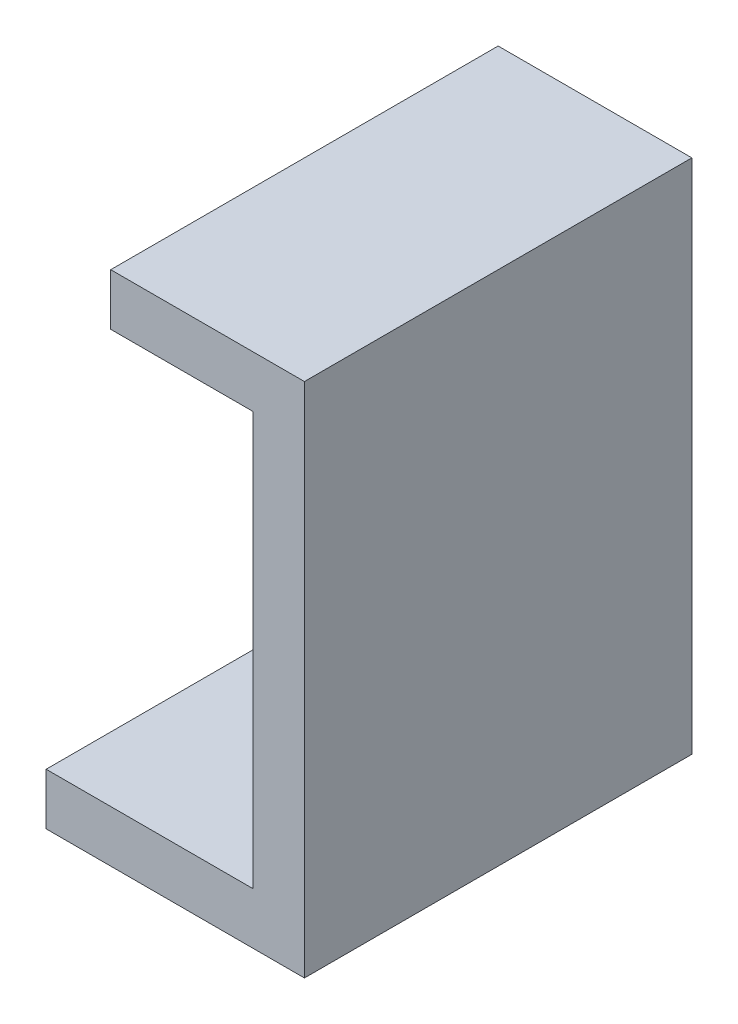
ISO-10303-21;
HEADER;
FILE_DESCRIPTION(('STEP AP214'),'2;1');
FILE_NAME('part.step','',(''),(''),'','','');
FILE_SCHEMA(('AUTOMOTIVE_DESIGN { 1 0 10303 214 1 1 1 1 }'));
ENDSEC;
DATA;
#1=APPLICATION_CONTEXT('core data for automotive mechanical design processes');
#2=APPLICATION_PROTOCOL_DEFINITION('international standard','automotive_design',2000,#1);
#3=PRODUCT_CONTEXT('',#1,'mechanical');
#4=PRODUCT('Part','Part','',(#3));
#5=PRODUCT_RELATED_PRODUCT_CATEGORY('part','',(#4));
#6=PRODUCT_DEFINITION_FORMATION('','',#4);
#7=PRODUCT_DEFINITION_CONTEXT('part definition',#1,'design');
#8=PRODUCT_DEFINITION('design','',#6,#7);
#9=PRODUCT_DEFINITION_SHAPE('','',#8);
#10=(LENGTH_UNIT() NAMED_UNIT(*) SI_UNIT(.MILLI.,.METRE.));
#11=(NAMED_UNIT(*) PLANE_ANGLE_UNIT() SI_UNIT($,.RADIAN.));
#12=(NAMED_UNIT(*) SI_UNIT($,.STERADIAN.) SOLID_ANGLE_UNIT());
#13=UNCERTAINTY_MEASURE_WITH_UNIT(LENGTH_MEASURE(1.E-05),#10,'distance_accuracy_value','');
#14=(GEOMETRIC_REPRESENTATION_CONTEXT(3) GLOBAL_UNCERTAINTY_ASSIGNED_CONTEXT((#13)) GLOBAL_UNIT_ASSIGNED_CONTEXT((#10,
#11,#12)) REPRESENTATION_CONTEXT('',''));
#15=CARTESIAN_POINT('',(0.,0.,0.));
#16=DIRECTION('',(0.,0.,1.));
#17=DIRECTION('',(1.,0.,0.));
#18=AXIS2_PLACEMENT_3D('',#15,#16,#17);
#19=CARTESIAN_POINT('',(-2.18399212189662,34.8873086385771,38.1));
#20=DIRECTION('',(0.,-1.,0.));
#21=DIRECTION('',(1.,0.,0.));
#22=AXIS2_PLACEMENT_3D('',#19,#20,#21);
#23=PLANE('',#22);
#24=DIRECTION('',(-1.,0.,0.));
#25=VECTOR('',#24,1.);
#26=CARTESIAN_POINT('',(-2.18399212189662,34.8873086385771,0.));
#27=LINE('',#26,#25);
#28=CARTESIAN_POINT('',(-2.18399212189662,34.8873086385771,0.));
#29=VERTEX_POINT('',#28);
#30=CARTESIAN_POINT('',(-21.2339921218966,34.887308638577,0.));
#31=VERTEX_POINT('',#30);
#32=EDGE_CURVE('E140',#29,#31,#27,.T.);
#33=ORIENTED_EDGE('',*,*,#32,.T.);
#34=DIRECTION('',(0.,0.,-1.));
#35=VECTOR('',#34,1.);
#36=CARTESIAN_POINT('',(-21.2339921218966,34.887308638577,38.1));
#37=LINE('',#36,#35);
#38=CARTESIAN_POINT('',(-21.2339921218966,34.887308638577,38.1));
#39=VERTEX_POINT('',#38);
#40=EDGE_CURVE('E11',#39,#31,#37,.T.);
#41=ORIENTED_EDGE('',*,*,#40,.F.);
#42=DIRECTION('',(-1.,0.,0.));
#43=VECTOR('',#42,1.);
#44=CARTESIAN_POINT('',(-2.18399212189662,34.8873086385771,38.1));
#45=LINE('',#44,#43);
#46=CARTESIAN_POINT('',(-2.18399212189662,34.8873086385771,38.1));
#47=VERTEX_POINT('',#46);
#48=EDGE_CURVE('E162',#47,#39,#45,.T.);
#49=ORIENTED_EDGE('',*,*,#48,.F.);
#50=DIRECTION('',(0.,0.,-1.));
#51=VECTOR('',#50,1.);
#52=CARTESIAN_POINT('',(-2.18399212189662,34.8873086385771,38.1));
#53=LINE('',#52,#51);
#54=EDGE_CURVE('E136',#47,#29,#53,.T.);
#55=ORIENTED_EDGE('',*,*,#54,.T.);
#56=EDGE_LOOP('',(#33,#41,#49,#55));
#57=FACE_BOUND('',#56,.T.);
#58=ADVANCED_FACE('F39',(#57),#23,.F.);
#59=CARTESIAN_POINT('',(-21.2339921218966,34.887308638577,38.1));
#60=DIRECTION('',(1.,0.,0.));
#61=DIRECTION('',(0.,0.,-1.));
#62=AXIS2_PLACEMENT_3D('',#59,#60,#61);
#63=PLANE('',#62);
#64=DIRECTION('',(0.,-1.,0.));
#65=VECTOR('',#64,1.);
#66=CARTESIAN_POINT('',(-21.2339921218966,34.887308638577,0.));
#67=LINE('',#66,#65);
#68=CARTESIAN_POINT('',(-21.2339921218966,29.8073086385771,0.));
#69=VERTEX_POINT('',#68);
#70=EDGE_CURVE('E144',#31,#69,#67,.T.);
#71=ORIENTED_EDGE('',*,*,#70,.T.);
#72=DIRECTION('',(0.,0.,-1.));
#73=VECTOR('',#72,1.);
#74=CARTESIAN_POINT('',(-21.2339921218966,29.8073086385771,38.1));
#75=LINE('',#74,#73);
#76=CARTESIAN_POINT('',(-21.2339921218966,29.8073086385771,38.1));
#77=VERTEX_POINT('',#76);
#78=EDGE_CURVE('E48',#77,#69,#75,.T.);
#79=ORIENTED_EDGE('',*,*,#78,.F.);
#80=DIRECTION('',(0.,-1.,0.));
#81=VECTOR('',#80,1.);
#82=CARTESIAN_POINT('',(-21.2339921218966,34.887308638577,38.1));
#83=LINE('',#82,#81);
#84=EDGE_CURVE('E99',#39,#77,#83,.T.);
#85=ORIENTED_EDGE('',*,*,#84,.F.);
#86=ORIENTED_EDGE('',*,*,#40,.T.);
#87=EDGE_LOOP('',(#71,#79,#85,#86));
#88=FACE_BOUND('',#87,.T.);
#89=ADVANCED_FACE('F208',(#88),#63,.F.);
#90=CARTESIAN_POINT('',(-21.2339921218966,29.8073086385771,38.1));
#91=DIRECTION('',(0.,1.,0.));
#92=DIRECTION('',(0.,0.,1.));
#93=AXIS2_PLACEMENT_3D('',#90,#91,#92);
#94=PLANE('',#93);
#95=DIRECTION('',(1.,0.,0.));
#96=VECTOR('',#95,1.);
#97=CARTESIAN_POINT('',(-21.2339921218966,29.8073086385771,0.));
#98=LINE('',#97,#96);
#99=CARTESIAN_POINT('',(-7.26399212189662,29.8073086385771,0.));
#100=VERTEX_POINT('',#99);
#101=EDGE_CURVE('E147',#69,#100,#98,.T.);
#102=ORIENTED_EDGE('',*,*,#101,.T.);
#103=DIRECTION('',(0.,0.,-1.));
#104=VECTOR('',#103,1.);
#105=CARTESIAN_POINT('',(-7.26399212189662,29.8073086385771,38.1));
#106=LINE('',#105,#104);
#107=CARTESIAN_POINT('',(-7.26399212189662,29.8073086385771,38.1));
#108=VERTEX_POINT('',#107);
#109=EDGE_CURVE('E173',#108,#100,#106,.T.);
#110=ORIENTED_EDGE('',*,*,#109,.F.);
#111=DIRECTION('',(1.,0.,0.));
#112=VECTOR('',#111,1.);
#113=CARTESIAN_POINT('',(-21.2339921218966,29.8073086385771,38.1));
#114=LINE('',#113,#112);
#115=EDGE_CURVE('E183',#77,#108,#114,.T.);
#116=ORIENTED_EDGE('',*,*,#115,.F.);
#117=ORIENTED_EDGE('',*,*,#78,.T.);
#118=EDGE_LOOP('',(#102,#110,#116,#117));
#119=FACE_BOUND('',#118,.T.);
#120=ADVANCED_FACE('F181',(#119),#94,.F.);
#121=CARTESIAN_POINT('',(-7.26399212189662,29.8073086385771,38.1));
#122=DIRECTION('',(1.,0.,0.));
#123=DIRECTION('',(0.,1.,0.));
#124=AXIS2_PLACEMENT_3D('',#121,#122,#123);
#125=PLANE('',#124);
#126=DIRECTION('',(0.,-1.,0.));
#127=VECTOR('',#126,1.);
#128=CARTESIAN_POINT('',(-7.26399212189662,29.8073086385771,0.));
#129=LINE('',#128,#127);
#130=CARTESIAN_POINT('',(-7.26399212189662,-10.8326913614229,0.));
#131=VERTEX_POINT('',#130);
#132=EDGE_CURVE('E150',#100,#131,#129,.T.);
#133=ORIENTED_EDGE('',*,*,#132,.T.);
#134=DIRECTION('',(0.,0.,-1.));
#135=VECTOR('',#134,1.);
#136=CARTESIAN_POINT('',(-7.26399212189662,-10.8326913614229,38.1));
#137=LINE('',#136,#135);
#138=CARTESIAN_POINT('',(-7.26399212189662,-10.8326913614229,38.1));
#139=VERTEX_POINT('',#138);
#140=EDGE_CURVE('E169',#139,#131,#137,.T.);
#141=ORIENTED_EDGE('',*,*,#140,.F.);
#142=DIRECTION('',(0.,-1.,0.));
#143=VECTOR('',#142,1.);
#144=CARTESIAN_POINT('',(-7.26399212189662,29.8073086385771,38.1));
#145=LINE('',#144,#143);
#146=EDGE_CURVE('E196',#108,#139,#145,.T.);
#147=ORIENTED_EDGE('',*,*,#146,.F.);
#148=ORIENTED_EDGE('',*,*,#109,.T.);
#149=EDGE_LOOP('',(#133,#141,#147,#148));
#150=FACE_BOUND('',#149,.T.);
#151=ADVANCED_FACE('F191',(#150),#125,.F.);
#152=CARTESIAN_POINT('',(-7.26399212189662,-10.8326913614229,38.1));
#153=DIRECTION('',(0.,-1.,0.));
#154=DIRECTION('',(1.,0.,0.));
#155=AXIS2_PLACEMENT_3D('',#152,#153,#154);
#156=PLANE('',#155);
#157=DIRECTION('',(-1.,0.,0.));
#158=VECTOR('',#157,1.);
#159=CARTESIAN_POINT('',(-7.26399212189662,-10.8326913614229,0.));
#160=LINE('',#159,#158);
#161=CARTESIAN_POINT('',(-27.5839921218966,-10.8326913614229,0.));
#162=VERTEX_POINT('',#161);
#163=EDGE_CURVE('E153',#131,#162,#160,.T.);
#164=ORIENTED_EDGE('',*,*,#163,.T.);
#165=DIRECTION('',(0.,0.,-1.));
#166=VECTOR('',#165,1.);
#167=CARTESIAN_POINT('',(-27.5839921218966,-10.8326913614229,38.1));
#168=LINE('',#167,#166);
#169=CARTESIAN_POINT('',(-27.5839921218966,-10.8326913614229,38.1));
#170=VERTEX_POINT('',#169);
#171=EDGE_CURVE('E129',#170,#162,#168,.T.);
#172=ORIENTED_EDGE('',*,*,#171,.F.);
#173=DIRECTION('',(-1.,0.,0.));
#174=VECTOR('',#173,1.);
#175=CARTESIAN_POINT('',(-7.26399212189662,-10.8326913614229,38.1));
#176=LINE('',#175,#174);
#177=EDGE_CURVE('E118',#139,#170,#176,.T.);
#178=ORIENTED_EDGE('',*,*,#177,.F.);
#179=ORIENTED_EDGE('',*,*,#140,.T.);
#180=EDGE_LOOP('',(#164,#172,#178,#179));
#181=FACE_BOUND('',#180,.T.);
#182=ADVANCED_FACE('F194',(#181),#156,.F.);
#183=CARTESIAN_POINT('',(-27.5839921218966,-10.8326913614229,38.1));
#184=DIRECTION('',(1.,0.,0.));
#185=DIRECTION('',(0.,1.,0.));
#186=AXIS2_PLACEMENT_3D('',#183,#184,#185);
#187=PLANE('',#186);
#188=DIRECTION('',(0.,-1.,0.));
#189=VECTOR('',#188,1.);
#190=CARTESIAN_POINT('',(-27.5839921218966,-10.8326913614229,0.));
#191=LINE('',#190,#189);
#192=CARTESIAN_POINT('',(-27.5839921218966,-15.9126913614229,0.));
#193=VERTEX_POINT('',#192);
#194=EDGE_CURVE('E127',#162,#193,#191,.T.);
#195=ORIENTED_EDGE('',*,*,#194,.T.);
#196=DIRECTION('',(0.,0.,-1.));
#197=VECTOR('',#196,1.);
#198=CARTESIAN_POINT('',(-27.5839921218966,-15.9126913614229,38.1));
#199=LINE('',#198,#197);
#200=CARTESIAN_POINT('',(-27.5839921218966,-15.9126913614229,38.1));
#201=VERTEX_POINT('',#200);
#202=EDGE_CURVE('E124',#201,#193,#199,.T.);
#203=ORIENTED_EDGE('',*,*,#202,.F.);
#204=DIRECTION('',(0.,-1.,0.));
#205=VECTOR('',#204,1.);
#206=CARTESIAN_POINT('',(-27.5839921218966,-10.8326913614229,38.1));
#207=LINE('',#206,#205);
#208=EDGE_CURVE('E112',#170,#201,#207,.T.);
#209=ORIENTED_EDGE('',*,*,#208,.F.);
#210=ORIENTED_EDGE('',*,*,#171,.T.);
#211=EDGE_LOOP('',(#195,#203,#209,#210));
#212=FACE_BOUND('',#211,.T.);
#213=ADVANCED_FACE('F125',(#212),#187,.F.);
#214=CARTESIAN_POINT('',(-27.5839921218966,-15.9126913614229,38.1));
#215=DIRECTION('',(0.,1.,0.));
#216=DIRECTION('',(0.,0.,1.));
#217=AXIS2_PLACEMENT_3D('',#214,#215,#216);
#218=PLANE('',#217);
#219=DIRECTION('',(1.,0.,0.));
#220=VECTOR('',#219,1.);
#221=CARTESIAN_POINT('',(-27.5839921218966,-15.9126913614229,0.));
#222=LINE('',#221,#220);
#223=CARTESIAN_POINT('',(-2.18399212189662,-15.9126913614229,0.));
#224=VERTEX_POINT('',#223);
#225=EDGE_CURVE('E85',#193,#224,#222,.T.);
#226=ORIENTED_EDGE('',*,*,#225,.T.);
#227=DIRECTION('',(0.,0.,-1.));
#228=VECTOR('',#227,1.);
#229=CARTESIAN_POINT('',(-2.18399212189662,-15.9126913614229,38.1));
#230=LINE('',#229,#228);
#231=CARTESIAN_POINT('',(-2.18399212189662,-15.9126913614229,38.1));
#232=VERTEX_POINT('',#231);
#233=EDGE_CURVE('E130',#232,#224,#230,.T.);
#234=ORIENTED_EDGE('',*,*,#233,.F.);
#235=DIRECTION('',(1.,0.,0.));
#236=VECTOR('',#235,1.);
#237=CARTESIAN_POINT('',(-27.5839921218966,-15.9126913614229,38.1));
#238=LINE('',#237,#236);
#239=EDGE_CURVE('E116',#201,#232,#238,.T.);
#240=ORIENTED_EDGE('',*,*,#239,.F.);
#241=ORIENTED_EDGE('',*,*,#202,.T.);
#242=EDGE_LOOP('',(#226,#234,#240,#241));
#243=FACE_BOUND('',#242,.T.);
#244=ADVANCED_FACE('F132',(#243),#218,.F.);
#245=CARTESIAN_POINT('',(-2.18399212189662,-15.9126913614229,38.1));
#246=DIRECTION('',(-1.,0.,0.));
#247=DIRECTION('',(0.,0.,1.));
#248=AXIS2_PLACEMENT_3D('',#245,#246,#247);
#249=PLANE('',#248);
#250=DIRECTION('',(0.,1.,0.));
#251=VECTOR('',#250,1.);
#252=CARTESIAN_POINT('',(-2.18399212189662,-15.9126913614229,0.));
#253=LINE('',#252,#251);
#254=EDGE_CURVE('E91',#224,#29,#253,.T.);
#255=ORIENTED_EDGE('',*,*,#254,.T.);
#256=ORIENTED_EDGE('',*,*,#54,.F.);
#257=DIRECTION('',(0.,1.,0.));
#258=VECTOR('',#257,1.);
#259=CARTESIAN_POINT('',(-2.18399212189662,-15.9126913614229,38.1));
#260=LINE('',#259,#258);
#261=EDGE_CURVE('E56',#232,#47,#260,.T.);
#262=ORIENTED_EDGE('',*,*,#261,.F.);
#263=ORIENTED_EDGE('',*,*,#233,.T.);
#264=EDGE_LOOP('',(#255,#256,#262,#263));
#265=FACE_BOUND('',#264,.T.);
#266=ADVANCED_FACE('F224',(#265),#249,.F.);
#267=CARTESIAN_POINT('',(0.,0.,38.1));
#268=DIRECTION('',(0.,0.,1.));
#269=DIRECTION('',(1.,0.,0.));
#270=AXIS2_PLACEMENT_3D('',#267,#268,#269);
#271=PLANE('',#270);
#272=ORIENTED_EDGE('',*,*,#48,.T.);
#273=ORIENTED_EDGE('',*,*,#84,.T.);
#274=ORIENTED_EDGE('',*,*,#115,.T.);
#275=ORIENTED_EDGE('',*,*,#146,.T.);
#276=ORIENTED_EDGE('',*,*,#177,.T.);
#277=ORIENTED_EDGE('',*,*,#208,.T.);
#278=ORIENTED_EDGE('',*,*,#239,.T.);
#279=ORIENTED_EDGE('',*,*,#261,.T.);
#280=EDGE_LOOP('',(#272,#273,#274,#275,#276,#277,#278,#279));
#281=FACE_BOUND('',#280,.T.);
#282=ADVANCED_FACE('F114',(#281),#271,.T.);
#283=CARTESIAN_POINT('',(0.,0.,0.));
#284=DIRECTION('',(0.,0.,1.));
#285=DIRECTION('',(1.,0.,0.));
#286=AXIS2_PLACEMENT_3D('',#283,#284,#285);
#287=PLANE('',#286);
#288=ORIENTED_EDGE('',*,*,#32,.F.);
#289=ORIENTED_EDGE('',*,*,#254,.F.);
#290=ORIENTED_EDGE('',*,*,#225,.F.);
#291=ORIENTED_EDGE('',*,*,#194,.F.);
#292=ORIENTED_EDGE('',*,*,#163,.F.);
#293=ORIENTED_EDGE('',*,*,#132,.F.);
#294=ORIENTED_EDGE('',*,*,#101,.F.);
#295=ORIENTED_EDGE('',*,*,#70,.F.);
#296=EDGE_LOOP('',(#288,#289,#290,#291,#292,#293,#294,#295));
#297=FACE_BOUND('',#296,.T.);
#298=ADVANCED_FACE('F187',(#297),#287,.F.);
#299=CLOSED_SHELL('',(#58,#89,#120,#151,#182,#213,#244,#266,#282,#298));
#300=MANIFOLD_SOLID_BREP('B2',#299);
#301=ADVANCED_BREP_SHAPE_REPRESENTATION('',(#18,#300),#14);
#302=SHAPE_DEFINITION_REPRESENTATION(#9,#301);
ENDSEC;
END-ISO-10303-21;
